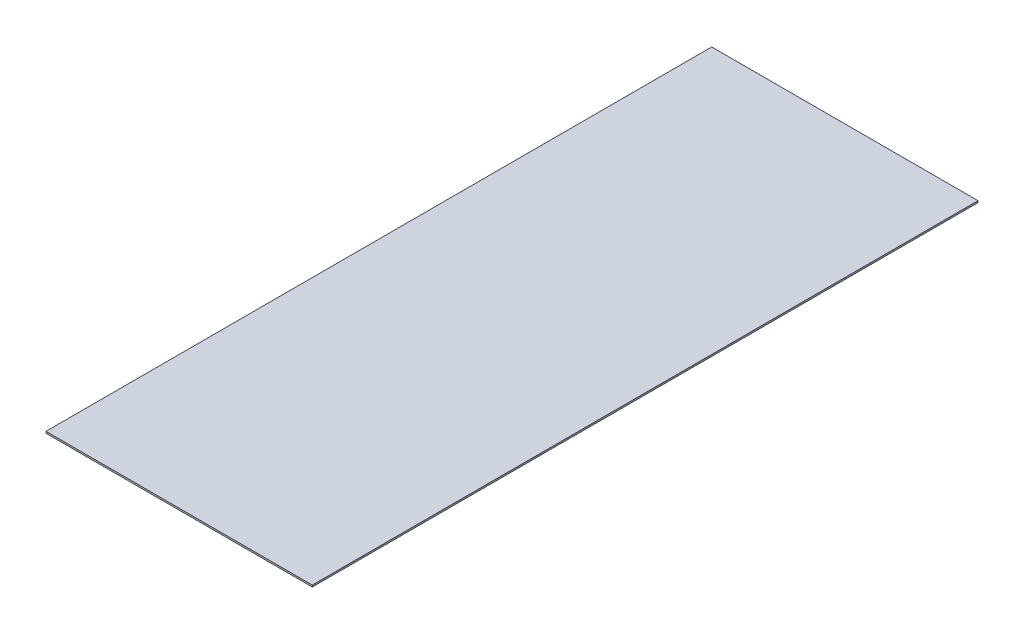
ISO-10303-21;
HEADER;
FILE_DESCRIPTION(('STEP AP214'),'2;1');
FILE_NAME('part.step','',(''),(''),'','','');
FILE_SCHEMA(('AUTOMOTIVE_DESIGN { 1 0 10303 214 1 1 1 1 }'));
ENDSEC;
DATA;
#1=APPLICATION_CONTEXT('core data for automotive mechanical design processes');
#2=APPLICATION_PROTOCOL_DEFINITION('international standard','automotive_design',2000,#1);
#3=PRODUCT_CONTEXT('',#1,'mechanical');
#4=PRODUCT('Part','Part','',(#3));
#5=PRODUCT_RELATED_PRODUCT_CATEGORY('part','',(#4));
#6=PRODUCT_DEFINITION_FORMATION('','',#4);
#7=PRODUCT_DEFINITION_CONTEXT('part definition',#1,'design');
#8=PRODUCT_DEFINITION('design','',#6,#7);
#9=PRODUCT_DEFINITION_SHAPE('','',#8);
#10=(LENGTH_UNIT() NAMED_UNIT(*) SI_UNIT(.MILLI.,.METRE.));
#11=(NAMED_UNIT(*) PLANE_ANGLE_UNIT() SI_UNIT($,.RADIAN.));
#12=(NAMED_UNIT(*) SI_UNIT($,.STERADIAN.) SOLID_ANGLE_UNIT());
#13=UNCERTAINTY_MEASURE_WITH_UNIT(LENGTH_MEASURE(1.E-05),#10,'distance_accuracy_value','');
#14=(GEOMETRIC_REPRESENTATION_CONTEXT(3) GLOBAL_UNCERTAINTY_ASSIGNED_CONTEXT((#13)) GLOBAL_UNIT_ASSIGNED_CONTEXT((#10,
#11,#12)) REPRESENTATION_CONTEXT('',''));
#15=CARTESIAN_POINT('',(0.,0.,0.));
#16=DIRECTION('',(0.,0.,1.));
#17=DIRECTION('',(1.,0.,0.));
#18=AXIS2_PLACEMENT_3D('',#15,#16,#17);
#19=CARTESIAN_POINT('',(609.6,7.9,1524.));
#20=DIRECTION('',(-1.,0.,0.));
#21=DIRECTION('',(0.,0.,1.));
#22=AXIS2_PLACEMENT_3D('',#19,#20,#21);
#23=PLANE('',#22);
#24=DIRECTION('',(0.,0.,-1.));
#25=VECTOR('',#24,1.);
#26=CARTESIAN_POINT('',(609.6,0.,1524.));
#27=LINE('',#26,#25);
#28=CARTESIAN_POINT('',(609.6,0.,1524.));
#29=VERTEX_POINT('',#28);
#30=CARTESIAN_POINT('',(609.6,0.,-1524.));
#31=VERTEX_POINT('',#30);
#32=EDGE_CURVE('E96',#29,#31,#27,.T.);
#33=ORIENTED_EDGE('',*,*,#32,.T.);
#34=DIRECTION('',(0.,-1.,0.));
#35=VECTOR('',#34,1.);
#36=CARTESIAN_POINT('',(609.6,7.9,-1524.));
#37=LINE('',#36,#35);
#38=CARTESIAN_POINT('',(609.6,7.9,-1524.));
#39=VERTEX_POINT('',#38);
#40=EDGE_CURVE('E11',#39,#31,#37,.T.);
#41=ORIENTED_EDGE('',*,*,#40,.F.);
#42=DIRECTION('',(0.,0.,-1.));
#43=VECTOR('',#42,1.);
#44=CARTESIAN_POINT('',(609.6,7.9,1524.));
#45=LINE('',#44,#43);
#46=CARTESIAN_POINT('',(609.6,7.9,1524.));
#47=VERTEX_POINT('',#46);
#48=EDGE_CURVE('E84',#47,#39,#45,.T.);
#49=ORIENTED_EDGE('',*,*,#48,.F.);
#50=DIRECTION('',(0.,-1.,0.));
#51=VECTOR('',#50,1.);
#52=CARTESIAN_POINT('',(609.6,7.9,1524.));
#53=LINE('',#52,#51);
#54=EDGE_CURVE('E92',#47,#29,#53,.T.);
#55=ORIENTED_EDGE('',*,*,#54,.T.);
#56=EDGE_LOOP('',(#33,#41,#49,#55));
#57=FACE_BOUND('',#56,.T.);
#58=ADVANCED_FACE('F33',(#57),#23,.F.);
#59=CARTESIAN_POINT('',(-609.6,7.9,-1524.));
#60=DIRECTION('',(0.,0.,1.));
#61=DIRECTION('',(1.,0.,0.));
#62=AXIS2_PLACEMENT_3D('',#59,#60,#61);
#63=PLANE('',#62);
#64=DIRECTION('',(-1.,0.,0.));
#65=VECTOR('',#64,1.);
#66=CARTESIAN_POINT('',(-609.6,0.,-1524.));
#67=LINE('',#66,#65);
#68=CARTESIAN_POINT('',(-609.6,0.,-1524.));
#69=VERTEX_POINT('',#68);
#70=EDGE_CURVE('E88',#31,#69,#67,.T.);
#71=ORIENTED_EDGE('',*,*,#70,.T.);
#72=DIRECTION('',(0.,-1.,0.));
#73=VECTOR('',#72,1.);
#74=CARTESIAN_POINT('',(-609.6,7.9,-1524.));
#75=LINE('',#74,#73);
#76=CARTESIAN_POINT('',(-609.6,7.9,-1524.));
#77=VERTEX_POINT('',#76);
#78=EDGE_CURVE('E41',#77,#69,#75,.T.);
#79=ORIENTED_EDGE('',*,*,#78,.F.);
#80=DIRECTION('',(-1.,0.,0.));
#81=VECTOR('',#80,1.);
#82=CARTESIAN_POINT('',(-609.6,7.9,-1524.));
#83=LINE('',#82,#81);
#84=EDGE_CURVE('E79',#39,#77,#83,.T.);
#85=ORIENTED_EDGE('',*,*,#84,.F.);
#86=ORIENTED_EDGE('',*,*,#40,.T.);
#87=EDGE_LOOP('',(#71,#79,#85,#86));
#88=FACE_BOUND('',#87,.T.);
#89=ADVANCED_FACE('F87',(#88),#63,.F.);
#90=CARTESIAN_POINT('',(-609.6,7.9,1524.));
#91=DIRECTION('',(1.,0.,0.));
#92=DIRECTION('',(0.,0.,-1.));
#93=AXIS2_PLACEMENT_3D('',#90,#91,#92);
#94=PLANE('',#93);
#95=DIRECTION('',(0.,0.,1.));
#96=VECTOR('',#95,1.);
#97=CARTESIAN_POINT('',(-609.6,0.,1524.));
#98=LINE('',#97,#96);
#99=CARTESIAN_POINT('',(-609.6,0.,1524.));
#100=VERTEX_POINT('',#99);
#101=EDGE_CURVE('E66',#69,#100,#98,.T.);
#102=ORIENTED_EDGE('',*,*,#101,.T.);
#103=DIRECTION('',(0.,-1.,0.));
#104=VECTOR('',#103,1.);
#105=CARTESIAN_POINT('',(-609.6,7.9,1524.));
#106=LINE('',#105,#104);
#107=CARTESIAN_POINT('',(-609.6,7.9,1524.));
#108=VERTEX_POINT('',#107);
#109=EDGE_CURVE('E89',#108,#100,#106,.T.);
#110=ORIENTED_EDGE('',*,*,#109,.F.);
#111=DIRECTION('',(0.,0.,1.));
#112=VECTOR('',#111,1.);
#113=CARTESIAN_POINT('',(-609.6,7.9,1524.));
#114=LINE('',#113,#112);
#115=EDGE_CURVE('E82',#77,#108,#114,.T.);
#116=ORIENTED_EDGE('',*,*,#115,.F.);
#117=ORIENTED_EDGE('',*,*,#78,.T.);
#118=EDGE_LOOP('',(#102,#110,#116,#117));
#119=FACE_BOUND('',#118,.T.);
#120=ADVANCED_FACE('F90',(#119),#94,.F.);
#121=CARTESIAN_POINT('',(-609.6,7.9,1524.));
#122=DIRECTION('',(0.,0.,-1.));
#123=DIRECTION('',(-1.,0.,0.));
#124=AXIS2_PLACEMENT_3D('',#121,#122,#123);
#125=PLANE('',#124);
#126=DIRECTION('',(1.,0.,0.));
#127=VECTOR('',#126,1.);
#128=CARTESIAN_POINT('',(-609.6,0.,1524.));
#129=LINE('',#128,#127);
#130=EDGE_CURVE('E72',#100,#29,#129,.T.);
#131=ORIENTED_EDGE('',*,*,#130,.T.);
#132=ORIENTED_EDGE('',*,*,#54,.F.);
#133=DIRECTION('',(1.,0.,0.));
#134=VECTOR('',#133,1.);
#135=CARTESIAN_POINT('',(-609.6,7.9,1524.));
#136=LINE('',#135,#134);
#137=EDGE_CURVE('E49',#108,#47,#136,.T.);
#138=ORIENTED_EDGE('',*,*,#137,.F.);
#139=ORIENTED_EDGE('',*,*,#109,.T.);
#140=EDGE_LOOP('',(#131,#132,#138,#139));
#141=FACE_BOUND('',#140,.T.);
#142=ADVANCED_FACE('F103',(#141),#125,.F.);
#143=CARTESIAN_POINT('',(0.,7.9,0.));
#144=DIRECTION('',(0.,-1.,0.));
#145=DIRECTION('',(0.,0.,-1.));
#146=AXIS2_PLACEMENT_3D('',#143,#144,#145);
#147=PLANE('',#146);
#148=ORIENTED_EDGE('',*,*,#48,.T.);
#149=ORIENTED_EDGE('',*,*,#84,.T.);
#150=ORIENTED_EDGE('',*,*,#115,.T.);
#151=ORIENTED_EDGE('',*,*,#137,.T.);
#152=EDGE_LOOP('',(#148,#149,#150,#151));
#153=FACE_BOUND('',#152,.T.);
#154=ADVANCED_FACE('F80',(#153),#147,.F.);
#155=CARTESIAN_POINT('',(0.,0.,0.));
#156=DIRECTION('',(0.,-1.,0.));
#157=DIRECTION('',(0.,0.,-1.));
#158=AXIS2_PLACEMENT_3D('',#155,#156,#157);
#159=PLANE('',#158);
#160=ORIENTED_EDGE('',*,*,#32,.F.);
#161=ORIENTED_EDGE('',*,*,#130,.F.);
#162=ORIENTED_EDGE('',*,*,#101,.F.);
#163=ORIENTED_EDGE('',*,*,#70,.F.);
#164=EDGE_LOOP('',(#160,#161,#162,#163));
#165=FACE_BOUND('',#164,.T.);
#166=ADVANCED_FACE('F106',(#165),#159,.T.);
#167=CLOSED_SHELL('',(#58,#89,#120,#142,#154,#166));
#168=MANIFOLD_SOLID_BREP('B2',#167);
#169=ADVANCED_BREP_SHAPE_REPRESENTATION('',(#18,#168),#14);
#170=SHAPE_DEFINITION_REPRESENTATION(#9,#169);
ENDSEC;
END-ISO-10303-21;
